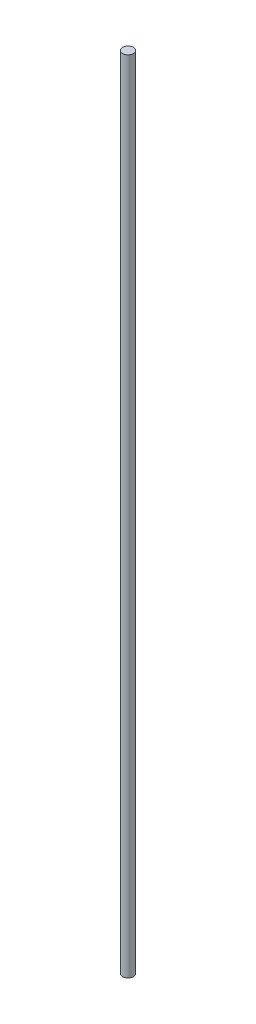
ISO-10303-21;
HEADER;
FILE_DESCRIPTION(('STEP AP214'),'2;1');
FILE_NAME('part.step','',(''),(''),'','','');
FILE_SCHEMA(('AUTOMOTIVE_DESIGN { 1 0 10303 214 1 1 1 1 }'));
ENDSEC;
DATA;
#1=APPLICATION_CONTEXT('core data for automotive mechanical design processes');
#2=APPLICATION_PROTOCOL_DEFINITION('international standard','automotive_design',2000,#1);
#3=PRODUCT_CONTEXT('',#1,'mechanical');
#4=PRODUCT('Part','Part','',(#3));
#5=PRODUCT_RELATED_PRODUCT_CATEGORY('part','',(#4));
#6=PRODUCT_DEFINITION_FORMATION('','',#4);
#7=PRODUCT_DEFINITION_CONTEXT('part definition',#1,'design');
#8=PRODUCT_DEFINITION('design','',#6,#7);
#9=PRODUCT_DEFINITION_SHAPE('','',#8);
#10=(LENGTH_UNIT() NAMED_UNIT(*) SI_UNIT(.MILLI.,.METRE.));
#11=(NAMED_UNIT(*) PLANE_ANGLE_UNIT() SI_UNIT($,.RADIAN.));
#12=(NAMED_UNIT(*) SI_UNIT($,.STERADIAN.) SOLID_ANGLE_UNIT());
#13=UNCERTAINTY_MEASURE_WITH_UNIT(LENGTH_MEASURE(1.E-05),#10,'distance_accuracy_value','');
#14=(GEOMETRIC_REPRESENTATION_CONTEXT(3) GLOBAL_UNCERTAINTY_ASSIGNED_CONTEXT((#13)) GLOBAL_UNIT_ASSIGNED_CONTEXT((#10,
#11,#12)) REPRESENTATION_CONTEXT('',''));
#15=CARTESIAN_POINT('',(0.,0.,0.));
#16=DIRECTION('',(0.,0.,1.));
#17=DIRECTION('',(1.,0.,0.));
#18=AXIS2_PLACEMENT_3D('',#15,#16,#17);
#19=CARTESIAN_POINT('',(0.,431.8,0.));
#20=DIRECTION('',(0.,-1.,0.));
#21=DIRECTION('',(0.,0.,-1.));
#22=AXIS2_PLACEMENT_3D('',#19,#20,#21);
#23=CYLINDRICAL_SURFACE('',#22,2.921);
#24=CARTESIAN_POINT('',(0.,431.8,0.));
#25=DIRECTION('',(0.,1.,0.));
#26=DIRECTION('',(0.,0.,1.));
#27=AXIS2_PLACEMENT_3D('',#24,#25,#26);
#28=CIRCLE('',#27,2.921);
#29=CARTESIAN_POINT('',(0.,431.8,2.921));
#30=VERTEX_POINT('',#29);
#31=EDGE_CURVE('E10',#30,#30,#28,.T.);
#32=ORIENTED_EDGE('',*,*,#31,.F.);
#33=EDGE_LOOP('',(#32));
#34=FACE_BOUND('',#33,.T.);
#35=CARTESIAN_POINT('',(0.,0.,0.));
#36=DIRECTION('',(0.,1.,0.));
#37=DIRECTION('',(0.,0.,1.));
#38=AXIS2_PLACEMENT_3D('',#35,#36,#37);
#39=CIRCLE('',#38,2.921);
#40=CARTESIAN_POINT('',(0.,0.,2.921));
#41=VERTEX_POINT('',#40);
#42=EDGE_CURVE('E40',#41,#41,#39,.T.);
#43=ORIENTED_EDGE('',*,*,#42,.T.);
#44=EDGE_LOOP('',(#43));
#45=FACE_BOUND('',#44,.T.);
#46=ADVANCED_FACE('F37',(#34,#45),#23,.T.);
#47=CARTESIAN_POINT('',(0.,431.8,0.));
#48=DIRECTION('',(0.,1.,0.));
#49=DIRECTION('',(0.,0.,1.));
#50=AXIS2_PLACEMENT_3D('',#47,#48,#49);
#51=PLANE('',#50);
#52=ORIENTED_EDGE('',*,*,#31,.T.);
#53=EDGE_LOOP('',(#52));
#54=FACE_BOUND('',#53,.T.);
#55=ADVANCED_FACE('F54',(#54),#51,.T.);
#56=CARTESIAN_POINT('',(0.,0.,0.));
#57=DIRECTION('',(0.,1.,0.));
#58=DIRECTION('',(0.,0.,1.));
#59=AXIS2_PLACEMENT_3D('',#56,#57,#58);
#60=PLANE('',#59);
#61=ORIENTED_EDGE('',*,*,#42,.F.);
#62=EDGE_LOOP('',(#61));
#63=FACE_BOUND('',#62,.T.);
#64=ADVANCED_FACE('F52',(#63),#60,.F.);
#65=CLOSED_SHELL('',(#46,#55,#64));
#66=MANIFOLD_SOLID_BREP('B2',#65);
#67=ADVANCED_BREP_SHAPE_REPRESENTATION('',(#18,#66),#14);
#68=SHAPE_DEFINITION_REPRESENTATION(#9,#67);
ENDSEC;
END-ISO-10303-21;
